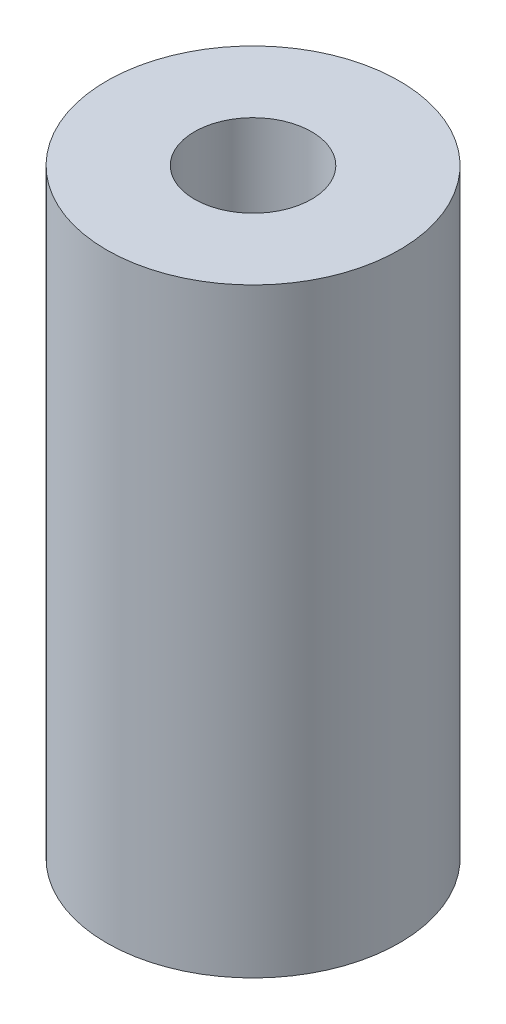
ISO-10303-21;
HEADER;
FILE_DESCRIPTION(('STEP AP214'),'2;1');
FILE_NAME('part.step','',(''),(''),'','','');
FILE_SCHEMA(('AUTOMOTIVE_DESIGN { 1 0 10303 214 1 1 1 1 }'));
ENDSEC;
DATA;
#1=APPLICATION_CONTEXT('core data for automotive mechanical design processes');
#2=APPLICATION_PROTOCOL_DEFINITION('international standard','automotive_design',2000,#1);
#3=PRODUCT_CONTEXT('',#1,'mechanical');
#4=PRODUCT('Part','Part','',(#3));
#5=PRODUCT_RELATED_PRODUCT_CATEGORY('part','',(#4));
#6=PRODUCT_DEFINITION_FORMATION('','',#4);
#7=PRODUCT_DEFINITION_CONTEXT('part definition',#1,'design');
#8=PRODUCT_DEFINITION('design','',#6,#7);
#9=PRODUCT_DEFINITION_SHAPE('','',#8);
#10=(LENGTH_UNIT() NAMED_UNIT(*) SI_UNIT(.MILLI.,.METRE.));
#11=(NAMED_UNIT(*) PLANE_ANGLE_UNIT() SI_UNIT($,.RADIAN.));
#12=(NAMED_UNIT(*) SI_UNIT($,.STERADIAN.) SOLID_ANGLE_UNIT());
#13=UNCERTAINTY_MEASURE_WITH_UNIT(LENGTH_MEASURE(1.E-05),#10,'distance_accuracy_value','');
#14=(GEOMETRIC_REPRESENTATION_CONTEXT(3) GLOBAL_UNCERTAINTY_ASSIGNED_CONTEXT((#13)) GLOBAL_UNIT_ASSIGNED_CONTEXT((#10,
#11,#12)) REPRESENTATION_CONTEXT('',''));
#15=CARTESIAN_POINT('',(0.,0.,0.));
#16=DIRECTION('',(0.,0.,1.));
#17=DIRECTION('',(1.,0.,0.));
#18=AXIS2_PLACEMENT_3D('',#15,#16,#17);
#19=CARTESIAN_POINT('',(0.,20.5,0.));
#20=DIRECTION('',(0.,1.,0.));
#21=DIRECTION('',(0.,0.,1.));
#22=AXIS2_PLACEMENT_3D('',#19,#20,#21);
#23=PLANE('',#22);
#24=CARTESIAN_POINT('',(0.,20.5,0.));
#25=DIRECTION('',(0.,1.,0.));
#26=DIRECTION('',(0.,0.,1.));
#27=AXIS2_PLACEMENT_3D('',#24,#25,#26);
#28=CIRCLE('',#27,5.);
#29=CARTESIAN_POINT('',(0.,20.5,5.));
#30=VERTEX_POINT('',#29);
#31=EDGE_CURVE('E10',#30,#30,#28,.T.);
#32=ORIENTED_EDGE('',*,*,#31,.T.);
#33=EDGE_LOOP('',(#32));
#34=FACE_BOUND('',#33,.T.);
#35=CARTESIAN_POINT('',(0.,20.5,0.));
#36=DIRECTION('',(0.,1.,0.));
#37=DIRECTION('',(0.,0.,1.));
#38=AXIS2_PLACEMENT_3D('',#35,#36,#37);
#39=CIRCLE('',#38,2.);
#40=CARTESIAN_POINT('',(0.,20.5,2.));
#41=VERTEX_POINT('',#40);
#42=EDGE_CURVE('E42',#41,#41,#39,.T.);
#43=ORIENTED_EDGE('',*,*,#42,.F.);
#44=EDGE_LOOP('',(#43));
#45=FACE_BOUND('',#44,.T.);
#46=ADVANCED_FACE('F31',(#34,#45),#23,.T.);
#47=CARTESIAN_POINT('',(0.,0.,0.));
#48=DIRECTION('',(0.,1.,0.));
#49=DIRECTION('',(0.,0.,1.));
#50=AXIS2_PLACEMENT_3D('',#47,#48,#49);
#51=PLANE('',#50);
#52=CARTESIAN_POINT('',(0.,0.,0.));
#53=DIRECTION('',(0.,1.,0.));
#54=DIRECTION('',(0.,0.,1.));
#55=AXIS2_PLACEMENT_3D('',#52,#53,#54);
#56=CIRCLE('',#55,5.);
#57=CARTESIAN_POINT('',(0.,0.,5.));
#58=VERTEX_POINT('',#57);
#59=EDGE_CURVE('E35',#58,#58,#56,.T.);
#60=ORIENTED_EDGE('',*,*,#59,.F.);
#61=EDGE_LOOP('',(#60));
#62=FACE_BOUND('',#61,.T.);
#63=CARTESIAN_POINT('',(0.,0.,0.));
#64=DIRECTION('',(0.,1.,0.));
#65=DIRECTION('',(0.,0.,1.));
#66=AXIS2_PLACEMENT_3D('',#63,#64,#65);
#67=CIRCLE('',#66,2.);
#68=CARTESIAN_POINT('',(0.,0.,2.));
#69=VERTEX_POINT('',#68);
#70=EDGE_CURVE('E44',#69,#69,#67,.T.);
#71=ORIENTED_EDGE('',*,*,#70,.T.);
#72=EDGE_LOOP('',(#71));
#73=FACE_BOUND('',#72,.T.);
#74=ADVANCED_FACE('F54',(#62,#73),#51,.F.);
#75=CARTESIAN_POINT('',(0.,20.5,0.));
#76=DIRECTION('',(0.,-1.,0.));
#77=DIRECTION('',(0.,0.,-1.));
#78=AXIS2_PLACEMENT_3D('',#75,#76,#77);
#79=CYLINDRICAL_SURFACE('',#78,5.);
#80=ORIENTED_EDGE('',*,*,#31,.F.);
#81=EDGE_LOOP('',(#80));
#82=FACE_BOUND('',#81,.T.);
#83=ORIENTED_EDGE('',*,*,#59,.T.);
#84=EDGE_LOOP('',(#83));
#85=FACE_BOUND('',#84,.T.);
#86=ADVANCED_FACE('F33',(#82,#85),#79,.T.);
#87=CARTESIAN_POINT('',(0.,20.5,0.));
#88=DIRECTION('',(0.,-1.,0.));
#89=DIRECTION('',(0.,0.,-1.));
#90=AXIS2_PLACEMENT_3D('',#87,#88,#89);
#91=CYLINDRICAL_SURFACE('',#90,2.);
#92=ORIENTED_EDGE('',*,*,#42,.T.);
#93=EDGE_LOOP('',(#92));
#94=FACE_BOUND('',#93,.T.);
#95=ORIENTED_EDGE('',*,*,#70,.F.);
#96=EDGE_LOOP('',(#95));
#97=FACE_BOUND('',#96,.T.);
#98=ADVANCED_FACE('F50',(#94,#97),#91,.F.);
#99=CLOSED_SHELL('',(#46,#74,#86,#98));
#100=MANIFOLD_SOLID_BREP('B2',#99);
#101=ADVANCED_BREP_SHAPE_REPRESENTATION('',(#18,#100),#14);
#102=SHAPE_DEFINITION_REPRESENTATION(#9,#101);
ENDSEC;
END-ISO-10303-21;
